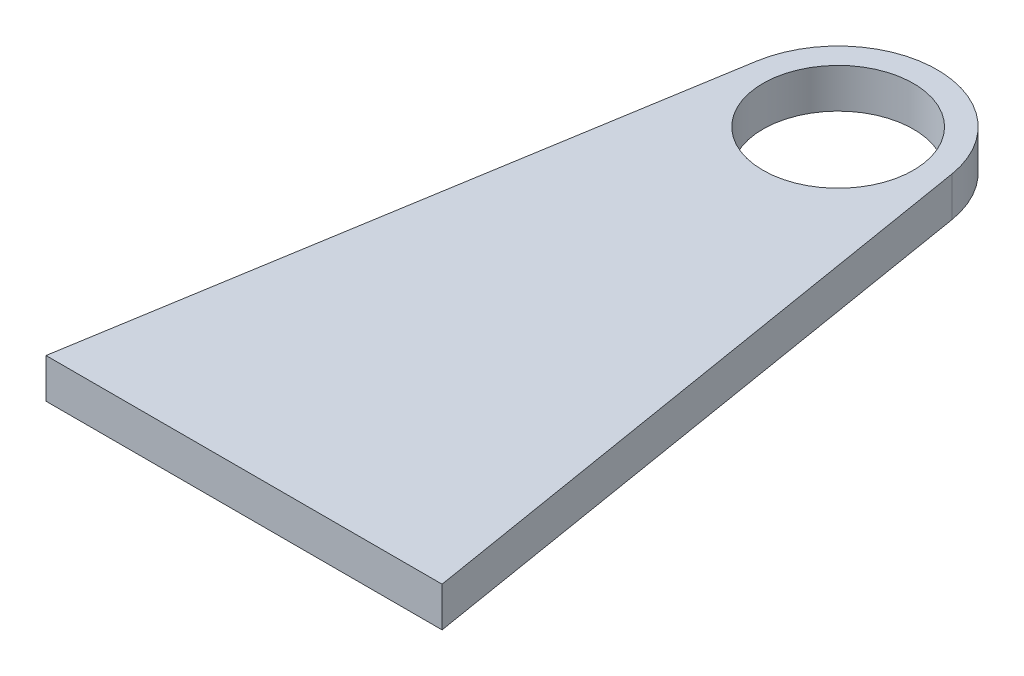
ISO-10303-21;
HEADER;
FILE_DESCRIPTION(('STEP AP214'),'2;1');
FILE_NAME('part.step','',(''),(''),'','','');
FILE_SCHEMA(('AUTOMOTIVE_DESIGN { 1 0 10303 214 1 1 1 1 }'));
ENDSEC;
DATA;
#1=APPLICATION_CONTEXT('core data for automotive mechanical design processes');
#2=APPLICATION_PROTOCOL_DEFINITION('international standard','automotive_design',2000,#1);
#3=PRODUCT_CONTEXT('',#1,'mechanical');
#4=PRODUCT('Part','Part','',(#3));
#5=PRODUCT_RELATED_PRODUCT_CATEGORY('part','',(#4));
#6=PRODUCT_DEFINITION_FORMATION('','',#4);
#7=PRODUCT_DEFINITION_CONTEXT('part definition',#1,'design');
#8=PRODUCT_DEFINITION('design','',#6,#7);
#9=PRODUCT_DEFINITION_SHAPE('','',#8);
#10=(LENGTH_UNIT() NAMED_UNIT(*) SI_UNIT(.MILLI.,.METRE.));
#11=(NAMED_UNIT(*) PLANE_ANGLE_UNIT() SI_UNIT($,.RADIAN.));
#12=(NAMED_UNIT(*) SI_UNIT($,.STERADIAN.) SOLID_ANGLE_UNIT());
#13=UNCERTAINTY_MEASURE_WITH_UNIT(LENGTH_MEASURE(1.E-05),#10,'distance_accuracy_value','');
#14=(GEOMETRIC_REPRESENTATION_CONTEXT(3) GLOBAL_UNCERTAINTY_ASSIGNED_CONTEXT((#13)) GLOBAL_UNIT_ASSIGNED_CONTEXT((#10,
#11,#12)) REPRESENTATION_CONTEXT('',''));
#15=CARTESIAN_POINT('',(0.,0.,0.));
#16=DIRECTION('',(0.,0.,1.));
#17=DIRECTION('',(1.,0.,0.));
#18=AXIS2_PLACEMENT_3D('',#15,#16,#17);
#19=CARTESIAN_POINT('',(0.,5.,0.));
#20=DIRECTION('',(0.,1.,0.));
#21=DIRECTION('',(0.,0.,1.));
#22=AXIS2_PLACEMENT_3D('',#19,#20,#21);
#23=PLANE('',#22);
#24=DIRECTION('',(-0.16224989991992,0.,0.98674969975976));
#25=VECTOR('',#24,1.);
#26=CARTESIAN_POINT('',(-25.,5.,75.));
#27=LINE('',#26,#25);
#28=CARTESIAN_POINT('',(-12.334371246997,5.,-2.028123748999));
#29=VERTEX_POINT('',#28);
#30=CARTESIAN_POINT('',(-25.,5.,75.));
#31=VERTEX_POINT('',#30);
#32=EDGE_CURVE('E89',#29,#31,#27,.T.);
#33=ORIENTED_EDGE('',*,*,#32,.T.);
#34=DIRECTION('',(1.,0.,0.));
#35=VECTOR('',#34,1.);
#36=CARTESIAN_POINT('',(-25.,5.,75.));
#37=LINE('',#36,#35);
#38=CARTESIAN_POINT('',(25.,5.,75.));
#39=VERTEX_POINT('',#38);
#40=EDGE_CURVE('E84',#31,#39,#37,.T.);
#41=ORIENTED_EDGE('',*,*,#40,.T.);
#42=DIRECTION('',(-0.16224989991992,0.,-0.98674969975976));
#43=VECTOR('',#42,1.);
#44=CARTESIAN_POINT('',(25.,5.,75.));
#45=LINE('',#44,#43);
#46=CARTESIAN_POINT('',(12.334371246997,5.,-2.028123748999));
#47=VERTEX_POINT('',#46);
#48=EDGE_CURVE('E87',#39,#47,#45,.T.);
#49=ORIENTED_EDGE('',*,*,#48,.T.);
#50=CARTESIAN_POINT('',(0.,5.,0.));
#51=DIRECTION('',(0.,1.,0.));
#52=DIRECTION('',(0.,0.,1.));
#53=AXIS2_PLACEMENT_3D('',#50,#51,#52);
#54=CIRCLE('',#53,12.5);
#55=EDGE_CURVE('E54',#47,#29,#54,.T.);
#56=ORIENTED_EDGE('',*,*,#55,.T.);
#57=EDGE_LOOP('',(#33,#41,#49,#56));
#58=FACE_BOUND('',#57,.T.);
#59=CARTESIAN_POINT('',(0.,5.,0.));
#60=DIRECTION('',(0.,1.,0.));
#61=DIRECTION('',(0.,0.,1.));
#62=AXIS2_PLACEMENT_3D('',#59,#60,#61);
#63=CIRCLE('',#62,9.5);
#64=CARTESIAN_POINT('',(0.,5.,9.5));
#65=VERTEX_POINT('',#64);
#66=EDGE_CURVE('E104',#65,#65,#63,.T.);
#67=ORIENTED_EDGE('',*,*,#66,.F.);
#68=EDGE_LOOP('',(#67));
#69=FACE_BOUND('',#68,.T.);
#70=ADVANCED_FACE('F37',(#58,#69),#23,.T.);
#71=CARTESIAN_POINT('',(0.,0.,0.));
#72=DIRECTION('',(0.,1.,0.));
#73=DIRECTION('',(0.,0.,1.));
#74=AXIS2_PLACEMENT_3D('',#71,#72,#73);
#75=PLANE('',#74);
#76=DIRECTION('',(-0.16224989991992,0.,0.98674969975976));
#77=VECTOR('',#76,1.);
#78=CARTESIAN_POINT('',(-25.,0.,75.));
#79=LINE('',#78,#77);
#80=CARTESIAN_POINT('',(-12.334371246997,0.,-2.028123748999));
#81=VERTEX_POINT('',#80);
#82=CARTESIAN_POINT('',(-25.,0.,75.));
#83=VERTEX_POINT('',#82);
#84=EDGE_CURVE('E101',#81,#83,#79,.T.);
#85=ORIENTED_EDGE('',*,*,#84,.F.);
#86=CARTESIAN_POINT('',(0.,0.,0.));
#87=DIRECTION('',(0.,1.,0.));
#88=DIRECTION('',(0.,0.,1.));
#89=AXIS2_PLACEMENT_3D('',#86,#87,#88);
#90=CIRCLE('',#89,12.5);
#91=CARTESIAN_POINT('',(12.334371246997,0.,-2.028123748999));
#92=VERTEX_POINT('',#91);
#93=EDGE_CURVE('E77',#92,#81,#90,.T.);
#94=ORIENTED_EDGE('',*,*,#93,.F.);
#95=DIRECTION('',(-0.16224989991992,0.,-0.98674969975976));
#96=VECTOR('',#95,1.);
#97=CARTESIAN_POINT('',(25.,0.,75.));
#98=LINE('',#97,#96);
#99=CARTESIAN_POINT('',(25.,0.,75.));
#100=VERTEX_POINT('',#99);
#101=EDGE_CURVE('E71',#100,#92,#98,.T.);
#102=ORIENTED_EDGE('',*,*,#101,.F.);
#103=DIRECTION('',(1.,0.,0.));
#104=VECTOR('',#103,1.);
#105=CARTESIAN_POINT('',(-25.,0.,75.));
#106=LINE('',#105,#104);
#107=EDGE_CURVE('E93',#83,#100,#106,.T.);
#108=ORIENTED_EDGE('',*,*,#107,.F.);
#109=EDGE_LOOP('',(#85,#94,#102,#108));
#110=FACE_BOUND('',#109,.T.);
#111=CARTESIAN_POINT('',(0.,0.,0.));
#112=DIRECTION('',(0.,1.,0.));
#113=DIRECTION('',(0.,0.,1.));
#114=AXIS2_PLACEMENT_3D('',#111,#112,#113);
#115=CIRCLE('',#114,9.5);
#116=CARTESIAN_POINT('',(0.,0.,9.5));
#117=VERTEX_POINT('',#116);
#118=EDGE_CURVE('E116',#117,#117,#115,.T.);
#119=ORIENTED_EDGE('',*,*,#118,.T.);
#120=EDGE_LOOP('',(#119));
#121=FACE_BOUND('',#120,.T.);
#122=ADVANCED_FACE('F112',(#110,#121),#75,.F.);
#123=CARTESIAN_POINT('',(-25.,5.,75.));
#124=DIRECTION('',(0.98674969975976,0.,0.16224989991992));
#125=DIRECTION('',(0.16224989991992,0.,-0.98674969975976));
#126=AXIS2_PLACEMENT_3D('',#123,#124,#125);
#127=PLANE('',#126);
#128=ORIENTED_EDGE('',*,*,#84,.T.);
#129=DIRECTION('',(0.,-1.,0.));
#130=VECTOR('',#129,1.);
#131=CARTESIAN_POINT('',(-25.,5.,75.));
#132=LINE('',#131,#130);
#133=EDGE_CURVE('E11',#31,#83,#132,.T.);
#134=ORIENTED_EDGE('',*,*,#133,.F.);
#135=ORIENTED_EDGE('',*,*,#32,.F.);
#136=DIRECTION('',(0.,-1.,0.));
#137=VECTOR('',#136,1.);
#138=CARTESIAN_POINT('',(-12.334371246997,5.,-2.028123748999));
#139=LINE('',#138,#137);
#140=EDGE_CURVE('E97',#29,#81,#139,.T.);
#141=ORIENTED_EDGE('',*,*,#140,.T.);
#142=EDGE_LOOP('',(#128,#134,#135,#141));
#143=FACE_BOUND('',#142,.T.);
#144=ADVANCED_FACE('F39',(#143),#127,.F.);
#145=CARTESIAN_POINT('',(-25.,5.,75.));
#146=DIRECTION('',(0.,0.,-1.));
#147=DIRECTION('',(-1.,0.,0.));
#148=AXIS2_PLACEMENT_3D('',#145,#146,#147);
#149=PLANE('',#148);
#150=ORIENTED_EDGE('',*,*,#107,.T.);
#151=DIRECTION('',(0.,-1.,0.));
#152=VECTOR('',#151,1.);
#153=CARTESIAN_POINT('',(25.,5.,75.));
#154=LINE('',#153,#152);
#155=EDGE_CURVE('E46',#39,#100,#154,.T.);
#156=ORIENTED_EDGE('',*,*,#155,.F.);
#157=ORIENTED_EDGE('',*,*,#40,.F.);
#158=ORIENTED_EDGE('',*,*,#133,.T.);
#159=EDGE_LOOP('',(#150,#156,#157,#158));
#160=FACE_BOUND('',#159,.T.);
#161=ADVANCED_FACE('F92',(#160),#149,.F.);
#162=CARTESIAN_POINT('',(25.,5.,75.));
#163=DIRECTION('',(-0.98674969975976,0.,0.16224989991992));
#164=DIRECTION('',(0.16224989991992,0.,0.98674969975976));
#165=AXIS2_PLACEMENT_3D('',#162,#163,#164);
#166=PLANE('',#165);
#167=ORIENTED_EDGE('',*,*,#101,.T.);
#168=DIRECTION('',(0.,-1.,0.));
#169=VECTOR('',#168,1.);
#170=CARTESIAN_POINT('',(12.334371246997,5.,-2.028123748999));
#171=LINE('',#170,#169);
#172=EDGE_CURVE('E94',#47,#92,#171,.T.);
#173=ORIENTED_EDGE('',*,*,#172,.F.);
#174=ORIENTED_EDGE('',*,*,#48,.F.);
#175=ORIENTED_EDGE('',*,*,#155,.T.);
#176=EDGE_LOOP('',(#167,#173,#174,#175));
#177=FACE_BOUND('',#176,.T.);
#178=ADVANCED_FACE('F95',(#177),#166,.F.);
#179=CARTESIAN_POINT('',(0.,5.,0.));
#180=DIRECTION('',(0.,-1.,0.));
#181=DIRECTION('',(0.,0.,-1.));
#182=AXIS2_PLACEMENT_3D('',#179,#180,#181);
#183=CYLINDRICAL_SURFACE('',#182,12.5);
#184=ORIENTED_EDGE('',*,*,#93,.T.);
#185=ORIENTED_EDGE('',*,*,#140,.F.);
#186=ORIENTED_EDGE('',*,*,#55,.F.);
#187=ORIENTED_EDGE('',*,*,#172,.T.);
#188=EDGE_LOOP('',(#184,#185,#186,#187));
#189=FACE_BOUND('',#188,.T.);
#190=ADVANCED_FACE('F109',(#189),#183,.T.);
#191=CARTESIAN_POINT('',(0.,5.,0.));
#192=DIRECTION('',(0.,-1.,0.));
#193=DIRECTION('',(0.,0.,-1.));
#194=AXIS2_PLACEMENT_3D('',#191,#192,#193);
#195=CYLINDRICAL_SURFACE('',#194,9.5);
#196=ORIENTED_EDGE('',*,*,#66,.T.);
#197=EDGE_LOOP('',(#196));
#198=FACE_BOUND('',#197,.T.);
#199=ORIENTED_EDGE('',*,*,#118,.F.);
#200=EDGE_LOOP('',(#199));
#201=FACE_BOUND('',#200,.T.);
#202=ADVANCED_FACE('F122',(#198,#201),#195,.F.);
#203=CLOSED_SHELL('',(#70,#122,#144,#161,#178,#190,#202));
#204=MANIFOLD_SOLID_BREP('B2',#203);
#205=ADVANCED_BREP_SHAPE_REPRESENTATION('',(#18,#204),#14);
#206=SHAPE_DEFINITION_REPRESENTATION(#9,#205);
ENDSEC;
END-ISO-10303-21;
